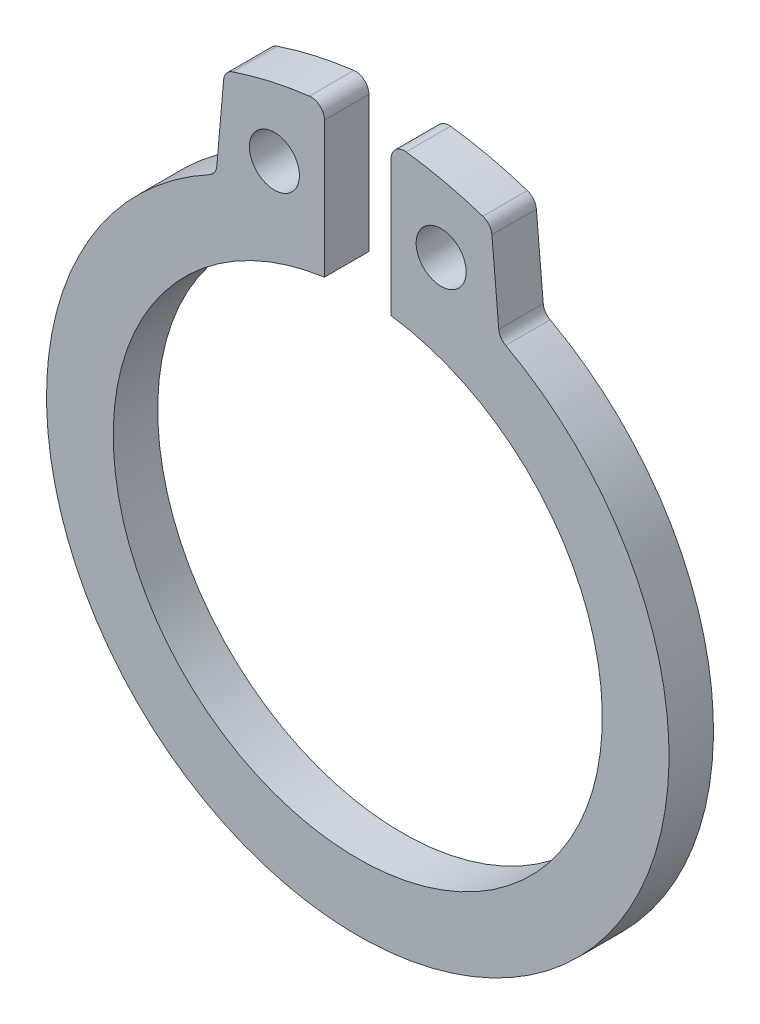
ISO-10303-21;
HEADER;
FILE_DESCRIPTION(('STEP AP214'),'2;1');
FILE_NAME('part.step','',(''),(''),'','','');
FILE_SCHEMA(('AUTOMOTIVE_DESIGN { 1 0 10303 214 1 1 1 1 }'));
ENDSEC;
DATA;
#1=APPLICATION_CONTEXT('core data for automotive mechanical design processes');
#2=APPLICATION_PROTOCOL_DEFINITION('international standard','automotive_design',2000,#1);
#3=PRODUCT_CONTEXT('',#1,'mechanical');
#4=PRODUCT('Part','Part','',(#3));
#5=PRODUCT_RELATED_PRODUCT_CATEGORY('part','',(#4));
#6=PRODUCT_DEFINITION_FORMATION('','',#4);
#7=PRODUCT_DEFINITION_CONTEXT('part definition',#1,'design');
#8=PRODUCT_DEFINITION('design','',#6,#7);
#9=PRODUCT_DEFINITION_SHAPE('','',#8);
#10=(LENGTH_UNIT() NAMED_UNIT(*) SI_UNIT(.MILLI.,.METRE.));
#11=(NAMED_UNIT(*) PLANE_ANGLE_UNIT() SI_UNIT($,.RADIAN.));
#12=(NAMED_UNIT(*) SI_UNIT($,.STERADIAN.) SOLID_ANGLE_UNIT());
#13=UNCERTAINTY_MEASURE_WITH_UNIT(LENGTH_MEASURE(1.E-05),#10,'distance_accuracy_value','');
#14=(GEOMETRIC_REPRESENTATION_CONTEXT(3) GLOBAL_UNCERTAINTY_ASSIGNED_CONTEXT((#13)) GLOBAL_UNIT_ASSIGNED_CONTEXT((#10,
#11,#12)) REPRESENTATION_CONTEXT('',''));
#15=CARTESIAN_POINT('',(0.,0.,0.));
#16=DIRECTION('',(0.,0.,1.));
#17=DIRECTION('',(1.,0.,0.));
#18=AXIS2_PLACEMENT_3D('',#15,#16,#17);
#19=CARTESIAN_POINT('',(0.,0.,1.));
#20=DIRECTION('',(0.,0.,-1.));
#21=DIRECTION('',(-1.,0.,0.));
#22=AXIS2_PLACEMENT_3D('',#19,#20,#21);
#23=PLANE('',#22);
#24=CARTESIAN_POINT('',(-1.875,7.14593837866892,1.));
#25=DIRECTION('',(0.,0.,1.));
#26=DIRECTION('',(1.,0.,0.));
#27=AXIS2_PLACEMENT_3D('',#24,#25,#26);
#28=CIRCLE('',#27,0.562500000000001);
#29=CARTESIAN_POINT('',(-1.3125,7.14593837866892,1.));
#30=VERTEX_POINT('',#29);
#31=EDGE_CURVE('E177',#30,#30,#28,.T.);
#32=ORIENTED_EDGE('',*,*,#31,.F.);
#33=EDGE_LOOP('',(#32));
#34=FACE_BOUND('',#33,.T.);
#35=CARTESIAN_POINT('',(0.,0.,1.));
#36=DIRECTION('',(0.,0.,1.));
#37=DIRECTION('',(-1.,0.,0.));
#38=AXIS2_PLACEMENT_3D('',#35,#36,#37);
#39=CIRCLE('',#38,8.875);
#40=CARTESIAN_POINT('',(2.81317449776246,8.41734365730299,1.));
#41=VERTEX_POINT('',#40);
#42=CARTESIAN_POINT('',(1.08673469387755,8.8082139338871,1.));
#43=VERTEX_POINT('',#42);
#44=EDGE_CURVE('E146',#41,#43,#39,.T.);
#45=ORIENTED_EDGE('',*,*,#44,.T.);
#46=CARTESIAN_POINT('',(1.05,8.51047149105148,1.));
#47=DIRECTION('',(0.,0.,-1.));
#48=DIRECTION('',(-1.,0.,0.));
#49=AXIS2_PLACEMENT_3D('',#46,#47,#48);
#50=CIRCLE('',#49,0.3);
#51=CARTESIAN_POINT('',(0.749999999999999,8.51047149105148,1.));
#52=VERTEX_POINT('',#51);
#53=EDGE_CURVE('E142',#43,#52,#50,.F.);
#54=ORIENTED_EDGE('',*,*,#53,.T.);
#55=DIRECTION('',(0.,-1.,0.));
#56=VECTOR('',#55,1.);
#57=CARTESIAN_POINT('',(0.749999999999999,8.843253077912,1.));
#58=LINE('',#57,#56);
#59=CARTESIAN_POINT('',(0.749999999999999,5.44862367942584,1.));
#60=VERTEX_POINT('',#59);
#61=EDGE_CURVE('E133',#52,#60,#58,.T.);
#62=ORIENTED_EDGE('',*,*,#61,.T.);
#63=CARTESIAN_POINT('',(0.,0.,1.));
#64=DIRECTION('',(0.,0.,-1.));
#65=DIRECTION('',(1.,0.,0.));
#66=AXIS2_PLACEMENT_3D('',#63,#64,#65);
#67=CIRCLE('',#66,5.5);
#68=CARTESIAN_POINT('',(-0.75,5.44862367942584,1.));
#69=VERTEX_POINT('',#68);
#70=EDGE_CURVE('E139',#60,#69,#67,.T.);
#71=ORIENTED_EDGE('',*,*,#70,.T.);
#72=DIRECTION('',(0.,1.,0.));
#73=VECTOR('',#72,1.);
#74=CARTESIAN_POINT('',(-0.75,8.843253077912,1.));
#75=LINE('',#74,#73);
#76=CARTESIAN_POINT('',(-0.75,8.51047149105148,1.));
#77=VERTEX_POINT('',#76);
#78=EDGE_CURVE('E161',#69,#77,#75,.T.);
#79=ORIENTED_EDGE('',*,*,#78,.T.);
#80=CARTESIAN_POINT('',(-1.05,8.51047149105148,1.));
#81=DIRECTION('',(0.,0.,-1.));
#82=DIRECTION('',(-1.,0.,0.));
#83=AXIS2_PLACEMENT_3D('',#80,#81,#82);
#84=CIRCLE('',#83,0.3);
#85=CARTESIAN_POINT('',(-1.08673469387755,8.8082139338871,1.));
#86=VERTEX_POINT('',#85);
#87=EDGE_CURVE('E223',#77,#86,#84,.F.);
#88=ORIENTED_EDGE('',*,*,#87,.T.);
#89=CARTESIAN_POINT('',(0.,0.,1.));
#90=DIRECTION('',(0.,0.,1.));
#91=DIRECTION('',(1.,0.,0.));
#92=AXIS2_PLACEMENT_3D('',#89,#90,#91);
#93=CIRCLE('',#92,8.875);
#94=CARTESIAN_POINT('',(-2.81317449776246,8.41734365730299,1.));
#95=VERTEX_POINT('',#94);
#96=EDGE_CURVE('E163',#86,#95,#93,.T.);
#97=ORIENTED_EDGE('',*,*,#96,.T.);
#98=CARTESIAN_POINT('',(-2.71808127530288,8.13281373085895,1.));
#99=DIRECTION('',(0.,0.,-1.));
#100=DIRECTION('',(-1.,0.,0.));
#101=AXIS2_PLACEMENT_3D('',#98,#99,#100);
#102=CIRCLE('',#101,0.3);
#103=CARTESIAN_POINT('',(-3.01693968473041,8.15896045368325,1.));
#104=VERTEX_POINT('',#103);
#105=EDGE_CURVE('E205',#95,#104,#102,.F.);
#106=ORIENTED_EDGE('',*,*,#105,.T.);
#107=DIRECTION('',(-0.0871557427476583,-0.996194698091746,0.));
#108=VECTOR('',#107,1.);
#109=CARTESIAN_POINT('',(-3.,8.35258193614406,1.));
#110=LINE('',#109,#108);
#111=CARTESIAN_POINT('',(-3.17114389581002,6.39639825573725,1.));
#112=VERTEX_POINT('',#111);
#113=EDGE_CURVE('E168',#104,#112,#110,.T.);
#114=ORIENTED_EDGE('',*,*,#113,.T.);
#115=CARTESIAN_POINT('',(-3.47000230523754,6.42254497856155,1.));
#116=DIRECTION('',(0.,0.,-1.));
#117=DIRECTION('',(-1.,0.,0.));
#118=AXIS2_PLACEMENT_3D('',#115,#116,#117);
#119=CIRCLE('',#118,0.3);
#120=CARTESIAN_POINT('',(-3.32739947077572,6.15860477396313,1.));
#121=VERTEX_POINT('',#120);
#122=EDGE_CURVE('E11',#112,#121,#119,.T.);
#123=ORIENTED_EDGE('',*,*,#122,.T.);
#124=CARTESIAN_POINT('',(0.,0.,1.));
#125=DIRECTION('',(0.,0.,1.));
#126=DIRECTION('',(1.,0.,0.));
#127=AXIS2_PLACEMENT_3D('',#124,#125,#126);
#128=CIRCLE('',#127,7.);
#129=CARTESIAN_POINT('',(3.32739947077572,6.15860477396313,1.));
#130=VERTEX_POINT('',#129);
#131=EDGE_CURVE('E170',#121,#130,#128,.T.);
#132=ORIENTED_EDGE('',*,*,#131,.T.);
#133=CARTESIAN_POINT('',(3.47000230523754,6.42254497856155,1.));
#134=DIRECTION('',(0.,0.,-1.));
#135=DIRECTION('',(-1.,0.,0.));
#136=AXIS2_PLACEMENT_3D('',#133,#134,#135);
#137=CIRCLE('',#136,0.3);
#138=CARTESIAN_POINT('',(3.17114389581001,6.39639825573725,1.));
#139=VERTEX_POINT('',#138);
#140=EDGE_CURVE('E242',#130,#139,#137,.T.);
#141=ORIENTED_EDGE('',*,*,#140,.T.);
#142=DIRECTION('',(-0.0871557427476584,0.996194698091746,0.));
#143=VECTOR('',#142,1.);
#144=CARTESIAN_POINT('',(3.,8.35258193614406,1.));
#145=LINE('',#144,#143);
#146=CARTESIAN_POINT('',(3.0169396847304,8.15896045368325,1.));
#147=VERTEX_POINT('',#146);
#148=EDGE_CURVE('E172',#139,#147,#145,.T.);
#149=ORIENTED_EDGE('',*,*,#148,.T.);
#150=CARTESIAN_POINT('',(2.71808127530288,8.13281373085895,1.));
#151=DIRECTION('',(0.,0.,-1.));
#152=DIRECTION('',(-1.,0.,0.));
#153=AXIS2_PLACEMENT_3D('',#150,#151,#152);
#154=CIRCLE('',#153,0.3);
#155=EDGE_CURVE('E207',#147,#41,#154,.F.);
#156=ORIENTED_EDGE('',*,*,#155,.T.);
#157=EDGE_LOOP('',(#45,#54,#62,#71,#79,#88,#97,#106,#114,#123,#132,#141,#149,#156));
#158=FACE_BOUND('',#157,.T.);
#159=CARTESIAN_POINT('',(1.875,7.14593837866892,1.));
#160=DIRECTION('',(0.,0.,1.));
#161=DIRECTION('',(-1.,0.,0.));
#162=AXIS2_PLACEMENT_3D('',#159,#160,#161);
#163=CIRCLE('',#162,0.562500000000001);
#164=CARTESIAN_POINT('',(1.3125,7.14593837866892,1.));
#165=VERTEX_POINT('',#164);
#166=EDGE_CURVE('E278',#165,#165,#163,.T.);
#167=ORIENTED_EDGE('',*,*,#166,.F.);
#168=EDGE_LOOP('',(#167));
#169=FACE_BOUND('',#168,.T.);
#170=ADVANCED_FACE('F34',(#34,#158,#169),#23,.F.);
#171=CARTESIAN_POINT('',(0.,0.,0.));
#172=DIRECTION('',(0.,0.,-1.));
#173=DIRECTION('',(-1.,0.,0.));
#174=AXIS2_PLACEMENT_3D('',#171,#172,#173);
#175=PLANE('',#174);
#176=CARTESIAN_POINT('',(-1.875,7.14593837866892,0.));
#177=DIRECTION('',(0.,0.,1.));
#178=DIRECTION('',(1.,0.,0.));
#179=AXIS2_PLACEMENT_3D('',#176,#177,#178);
#180=CIRCLE('',#179,0.562500000000001);
#181=CARTESIAN_POINT('',(-1.3125,7.14593837866892,0.));
#182=VERTEX_POINT('',#181);
#183=EDGE_CURVE('E275',#182,#182,#180,.T.);
#184=ORIENTED_EDGE('',*,*,#183,.T.);
#185=EDGE_LOOP('',(#184));
#186=FACE_BOUND('',#185,.T.);
#187=DIRECTION('',(0.,-1.,0.));
#188=VECTOR('',#187,1.);
#189=CARTESIAN_POINT('',(0.749999999999999,8.843253077912,0.));
#190=LINE('',#189,#188);
#191=CARTESIAN_POINT('',(0.749999999999999,8.51047149105148,0.));
#192=VERTEX_POINT('',#191);
#193=CARTESIAN_POINT('',(0.749999999999999,5.44862367942584,0.));
#194=VERTEX_POINT('',#193);
#195=EDGE_CURVE('E152',#192,#194,#190,.T.);
#196=ORIENTED_EDGE('',*,*,#195,.F.);
#197=CARTESIAN_POINT('',(1.05,8.51047149105148,0.));
#198=DIRECTION('',(0.,0.,-1.));
#199=DIRECTION('',(-1.,0.,0.));
#200=AXIS2_PLACEMENT_3D('',#197,#198,#199);
#201=CIRCLE('',#200,0.3);
#202=CARTESIAN_POINT('',(1.08673469387755,8.8082139338871,0.));
#203=VERTEX_POINT('',#202);
#204=EDGE_CURVE('E219',#192,#203,#201,.T.);
#205=ORIENTED_EDGE('',*,*,#204,.T.);
#206=CARTESIAN_POINT('',(0.,0.,0.));
#207=DIRECTION('',(0.,0.,1.));
#208=DIRECTION('',(-1.,0.,0.));
#209=AXIS2_PLACEMENT_3D('',#206,#207,#208);
#210=CIRCLE('',#209,8.875);
#211=CARTESIAN_POINT('',(2.81317449776246,8.41734365730299,0.));
#212=VERTEX_POINT('',#211);
#213=EDGE_CURVE('E174',#212,#203,#210,.T.);
#214=ORIENTED_EDGE('',*,*,#213,.F.);
#215=CARTESIAN_POINT('',(2.71808127530288,8.13281373085895,0.));
#216=DIRECTION('',(0.,0.,-1.));
#217=DIRECTION('',(-1.,0.,0.));
#218=AXIS2_PLACEMENT_3D('',#215,#216,#217);
#219=CIRCLE('',#218,0.3);
#220=CARTESIAN_POINT('',(3.0169396847304,8.15896045368325,0.));
#221=VERTEX_POINT('',#220);
#222=EDGE_CURVE('E199',#212,#221,#219,.T.);
#223=ORIENTED_EDGE('',*,*,#222,.T.);
#224=DIRECTION('',(-0.0871557427476584,0.996194698091746,0.));
#225=VECTOR('',#224,1.);
#226=CARTESIAN_POINT('',(3.,8.35258193614406,0.));
#227=LINE('',#226,#225);
#228=CARTESIAN_POINT('',(3.17114389581001,6.39639825573725,0.));
#229=VERTEX_POINT('',#228);
#230=EDGE_CURVE('E191',#229,#221,#227,.T.);
#231=ORIENTED_EDGE('',*,*,#230,.F.);
#232=CARTESIAN_POINT('',(3.47000230523754,6.42254497856155,0.));
#233=DIRECTION('',(0.,0.,-1.));
#234=DIRECTION('',(-1.,0.,0.));
#235=AXIS2_PLACEMENT_3D('',#232,#233,#234);
#236=CIRCLE('',#235,0.3);
#237=CARTESIAN_POINT('',(3.32739947077572,6.15860477396313,0.));
#238=VERTEX_POINT('',#237);
#239=EDGE_CURVE('E240',#229,#238,#236,.F.);
#240=ORIENTED_EDGE('',*,*,#239,.T.);
#241=CARTESIAN_POINT('',(0.,0.,0.));
#242=DIRECTION('',(0.,0.,1.));
#243=DIRECTION('',(1.,0.,0.));
#244=AXIS2_PLACEMENT_3D('',#241,#242,#243);
#245=CIRCLE('',#244,7.);
#246=CARTESIAN_POINT('',(-3.32739947077572,6.15860477396313,0.));
#247=VERTEX_POINT('',#246);
#248=EDGE_CURVE('E189',#247,#238,#245,.T.);
#249=ORIENTED_EDGE('',*,*,#248,.F.);
#250=CARTESIAN_POINT('',(-3.47000230523754,6.42254497856155,0.));
#251=DIRECTION('',(0.,0.,-1.));
#252=DIRECTION('',(-1.,0.,0.));
#253=AXIS2_PLACEMENT_3D('',#250,#251,#252);
#254=CIRCLE('',#253,0.3);
#255=CARTESIAN_POINT('',(-3.17114389581002,6.39639825573725,0.));
#256=VERTEX_POINT('',#255);
#257=EDGE_CURVE('E42',#247,#256,#254,.F.);
#258=ORIENTED_EDGE('',*,*,#257,.T.);
#259=DIRECTION('',(-0.0871557427476583,-0.996194698091746,0.));
#260=VECTOR('',#259,1.);
#261=CARTESIAN_POINT('',(-3.,8.35258193614406,0.));
#262=LINE('',#261,#260);
#263=CARTESIAN_POINT('',(-3.01693968473041,8.15896045368325,0.));
#264=VERTEX_POINT('',#263);
#265=EDGE_CURVE('E186',#264,#256,#262,.T.);
#266=ORIENTED_EDGE('',*,*,#265,.F.);
#267=CARTESIAN_POINT('',(-2.71808127530288,8.13281373085895,0.));
#268=DIRECTION('',(0.,0.,-1.));
#269=DIRECTION('',(-1.,0.,0.));
#270=AXIS2_PLACEMENT_3D('',#267,#268,#269);
#271=CIRCLE('',#270,0.3);
#272=CARTESIAN_POINT('',(-2.81317449776246,8.41734365730299,0.));
#273=VERTEX_POINT('',#272);
#274=EDGE_CURVE('E196',#264,#273,#271,.T.);
#275=ORIENTED_EDGE('',*,*,#274,.T.);
#276=CARTESIAN_POINT('',(0.,0.,0.));
#277=DIRECTION('',(0.,0.,1.));
#278=DIRECTION('',(1.,0.,0.));
#279=AXIS2_PLACEMENT_3D('',#276,#277,#278);
#280=CIRCLE('',#279,8.875);
#281=CARTESIAN_POINT('',(-1.08673469387755,8.8082139338871,0.));
#282=VERTEX_POINT('',#281);
#283=EDGE_CURVE('E184',#282,#273,#280,.T.);
#284=ORIENTED_EDGE('',*,*,#283,.F.);
#285=CARTESIAN_POINT('',(-1.05,8.51047149105148,0.));
#286=DIRECTION('',(0.,0.,-1.));
#287=DIRECTION('',(-1.,0.,0.));
#288=AXIS2_PLACEMENT_3D('',#285,#286,#287);
#289=CIRCLE('',#288,0.3);
#290=CARTESIAN_POINT('',(-0.75,8.51047149105148,0.));
#291=VERTEX_POINT('',#290);
#292=EDGE_CURVE('E217',#282,#291,#289,.T.);
#293=ORIENTED_EDGE('',*,*,#292,.T.);
#294=DIRECTION('',(0.,1.,0.));
#295=VECTOR('',#294,1.);
#296=CARTESIAN_POINT('',(-0.75,8.843253077912,0.));
#297=LINE('',#296,#295);
#298=CARTESIAN_POINT('',(-0.75,5.44862367942584,0.));
#299=VERTEX_POINT('',#298);
#300=EDGE_CURVE('E181',#299,#291,#297,.T.);
#301=ORIENTED_EDGE('',*,*,#300,.F.);
#302=CARTESIAN_POINT('',(0.,0.,0.));
#303=DIRECTION('',(0.,0.,-1.));
#304=DIRECTION('',(1.,0.,0.));
#305=AXIS2_PLACEMENT_3D('',#302,#303,#304);
#306=CIRCLE('',#305,5.5);
#307=EDGE_CURVE('E179',#194,#299,#306,.T.);
#308=ORIENTED_EDGE('',*,*,#307,.F.);
#309=EDGE_LOOP('',(#196,#205,#214,#223,#231,#240,#249,#258,#266,#275,#284,#293,#301,#308));
#310=FACE_BOUND('',#309,.T.);
#311=CARTESIAN_POINT('',(1.875,7.14593837866892,0.));
#312=DIRECTION('',(0.,0.,1.));
#313=DIRECTION('',(-1.,0.,0.));
#314=AXIS2_PLACEMENT_3D('',#311,#312,#313);
#315=CIRCLE('',#314,0.562500000000001);
#316=CARTESIAN_POINT('',(1.3125,7.14593837866892,0.));
#317=VERTEX_POINT('',#316);
#318=EDGE_CURVE('E281',#317,#317,#315,.T.);
#319=ORIENTED_EDGE('',*,*,#318,.T.);
#320=EDGE_LOOP('',(#319));
#321=FACE_BOUND('',#320,.T.);
#322=ADVANCED_FACE('F246',(#186,#310,#321),#175,.T.);
#323=CARTESIAN_POINT('',(0.,0.,1.));
#324=DIRECTION('',(0.,0.,-1.));
#325=DIRECTION('',(-1.,0.,0.));
#326=AXIS2_PLACEMENT_3D('',#323,#324,#325);
#327=CYLINDRICAL_SURFACE('',#326,8.875);
#328=ORIENTED_EDGE('',*,*,#213,.T.);
#329=DIRECTION('',(0.,0.,-1.));
#330=VECTOR('',#329,1.);
#331=CARTESIAN_POINT('',(1.08673469387755,8.8082139338871,1.));
#332=LINE('',#331,#330);
#333=EDGE_CURVE('E221',#203,#43,#332,.F.);
#334=ORIENTED_EDGE('',*,*,#333,.T.);
#335=ORIENTED_EDGE('',*,*,#44,.F.);
#336=DIRECTION('',(0.,0.,-1.));
#337=VECTOR('',#336,1.);
#338=CARTESIAN_POINT('',(2.81317449776246,8.41734365730299,1.));
#339=LINE('',#338,#337);
#340=EDGE_CURVE('E155',#41,#212,#339,.T.);
#341=ORIENTED_EDGE('',*,*,#340,.T.);
#342=EDGE_LOOP('',(#328,#334,#335,#341));
#343=FACE_BOUND('',#342,.T.);
#344=ADVANCED_FACE('F272',(#343),#327,.T.);
#345=CARTESIAN_POINT('',(0.749999999999999,8.843253077912,1.));
#346=DIRECTION('',(1.,0.,0.));
#347=DIRECTION('',(0.,0.,-1.));
#348=AXIS2_PLACEMENT_3D('',#345,#346,#347);
#349=PLANE('',#348);
#350=ORIENTED_EDGE('',*,*,#61,.F.);
#351=DIRECTION('',(0.,0.,-1.));
#352=VECTOR('',#351,1.);
#353=CARTESIAN_POINT('',(0.749999999999999,8.51047149105148,1.));
#354=LINE('',#353,#352);
#355=EDGE_CURVE('E215',#52,#192,#354,.T.);
#356=ORIENTED_EDGE('',*,*,#355,.T.);
#357=ORIENTED_EDGE('',*,*,#195,.T.);
#358=DIRECTION('',(0.,0.,-1.));
#359=VECTOR('',#358,1.);
#360=CARTESIAN_POINT('',(0.749999999999999,5.44862367942584,1.));
#361=LINE('',#360,#359);
#362=EDGE_CURVE('E149',#60,#194,#361,.T.);
#363=ORIENTED_EDGE('',*,*,#362,.F.);
#364=EDGE_LOOP('',(#350,#356,#357,#363));
#365=FACE_BOUND('',#364,.T.);
#366=ADVANCED_FACE('F150',(#365),#349,.F.);
#367=CARTESIAN_POINT('',(0.,0.,1.));
#368=DIRECTION('',(0.,0.,-1.));
#369=DIRECTION('',(-1.,0.,0.));
#370=AXIS2_PLACEMENT_3D('',#367,#368,#369);
#371=CYLINDRICAL_SURFACE('',#370,5.5);
#372=ORIENTED_EDGE('',*,*,#307,.T.);
#373=DIRECTION('',(0.,0.,-1.));
#374=VECTOR('',#373,1.);
#375=CARTESIAN_POINT('',(-0.75,5.44862367942584,1.));
#376=LINE('',#375,#374);
#377=EDGE_CURVE('E156',#69,#299,#376,.T.);
#378=ORIENTED_EDGE('',*,*,#377,.F.);
#379=ORIENTED_EDGE('',*,*,#70,.F.);
#380=ORIENTED_EDGE('',*,*,#362,.T.);
#381=EDGE_LOOP('',(#372,#378,#379,#380));
#382=FACE_BOUND('',#381,.T.);
#383=ADVANCED_FACE('F158',(#382),#371,.F.);
#384=CARTESIAN_POINT('',(-0.75,8.843253077912,1.));
#385=DIRECTION('',(-1.,0.,0.));
#386=DIRECTION('',(0.,0.,1.));
#387=AXIS2_PLACEMENT_3D('',#384,#385,#386);
#388=PLANE('',#387);
#389=ORIENTED_EDGE('',*,*,#300,.T.);
#390=DIRECTION('',(0.,0.,-1.));
#391=VECTOR('',#390,1.);
#392=CARTESIAN_POINT('',(-0.75,8.51047149105148,1.));
#393=LINE('',#392,#391);
#394=EDGE_CURVE('E229',#291,#77,#393,.F.);
#395=ORIENTED_EDGE('',*,*,#394,.T.);
#396=ORIENTED_EDGE('',*,*,#78,.F.);
#397=ORIENTED_EDGE('',*,*,#377,.T.);
#398=EDGE_LOOP('',(#389,#395,#396,#397));
#399=FACE_BOUND('',#398,.T.);
#400=ADVANCED_FACE('F311',(#399),#388,.F.);
#401=CARTESIAN_POINT('',(0.,0.,1.));
#402=DIRECTION('',(0.,0.,-1.));
#403=DIRECTION('',(-1.,0.,0.));
#404=AXIS2_PLACEMENT_3D('',#401,#402,#403);
#405=CYLINDRICAL_SURFACE('',#404,8.875);
#406=ORIENTED_EDGE('',*,*,#96,.F.);
#407=DIRECTION('',(0.,0.,-1.));
#408=VECTOR('',#407,1.);
#409=CARTESIAN_POINT('',(-1.08673469387755,8.8082139338871,1.));
#410=LINE('',#409,#408);
#411=EDGE_CURVE('E226',#86,#282,#410,.T.);
#412=ORIENTED_EDGE('',*,*,#411,.T.);
#413=ORIENTED_EDGE('',*,*,#283,.T.);
#414=DIRECTION('',(0.,0.,-1.));
#415=VECTOR('',#414,1.);
#416=CARTESIAN_POINT('',(-2.81317449776246,8.41734365730299,1.));
#417=LINE('',#416,#415);
#418=EDGE_CURVE('E212',#273,#95,#417,.F.);
#419=ORIENTED_EDGE('',*,*,#418,.T.);
#420=EDGE_LOOP('',(#406,#412,#413,#419));
#421=FACE_BOUND('',#420,.T.);
#422=ADVANCED_FACE('F308',(#421),#405,.T.);
#423=CARTESIAN_POINT('',(-3.,8.35258193614406,1.));
#424=DIRECTION('',(0.996194698091746,-0.0871557427476583,0.));
#425=DIRECTION('',(0.0871557427476583,0.996194698091746,0.));
#426=AXIS2_PLACEMENT_3D('',#423,#424,#425);
#427=PLANE('',#426);
#428=ORIENTED_EDGE('',*,*,#265,.T.);
#429=DIRECTION('',(0.,0.,1.));
#430=VECTOR('',#429,1.);
#431=CARTESIAN_POINT('',(-3.17114389581002,6.39639825573725,1.));
#432=LINE('',#431,#430);
#433=EDGE_CURVE('E238',#256,#112,#432,.T.);
#434=ORIENTED_EDGE('',*,*,#433,.T.);
#435=ORIENTED_EDGE('',*,*,#113,.F.);
#436=DIRECTION('',(0.,0.,-1.));
#437=VECTOR('',#436,1.);
#438=CARTESIAN_POINT('',(-3.01693968473041,8.15896045368325,1.));
#439=LINE('',#438,#437);
#440=EDGE_CURVE('E209',#104,#264,#439,.T.);
#441=ORIENTED_EDGE('',*,*,#440,.T.);
#442=EDGE_LOOP('',(#428,#434,#435,#441));
#443=FACE_BOUND('',#442,.T.);
#444=ADVANCED_FACE('F252',(#443),#427,.F.);
#445=CARTESIAN_POINT('',(0.,0.,1.));
#446=DIRECTION('',(0.,0.,-1.));
#447=DIRECTION('',(-1.,0.,0.));
#448=AXIS2_PLACEMENT_3D('',#445,#446,#447);
#449=CYLINDRICAL_SURFACE('',#448,7.);
#450=ORIENTED_EDGE('',*,*,#248,.T.);
#451=DIRECTION('',(0.,0.,-1.));
#452=VECTOR('',#451,1.);
#453=CARTESIAN_POINT('',(3.32739947077572,6.15860477396313,1.));
#454=LINE('',#453,#452);
#455=EDGE_CURVE('E49',#238,#130,#454,.F.);
#456=ORIENTED_EDGE('',*,*,#455,.T.);
#457=ORIENTED_EDGE('',*,*,#131,.F.);
#458=DIRECTION('',(0.,0.,-1.));
#459=VECTOR('',#458,1.);
#460=CARTESIAN_POINT('',(-3.32739947077572,6.15860477396313,1.));
#461=LINE('',#460,#459);
#462=EDGE_CURVE('E234',#121,#247,#461,.T.);
#463=ORIENTED_EDGE('',*,*,#462,.T.);
#464=EDGE_LOOP('',(#450,#456,#457,#463));
#465=FACE_BOUND('',#464,.T.);
#466=ADVANCED_FACE('F255',(#465),#449,.T.);
#467=CARTESIAN_POINT('',(3.,8.35258193614406,1.));
#468=DIRECTION('',(-0.996194698091746,-0.0871557427476584,0.));
#469=DIRECTION('',(0.0871557427476584,-0.996194698091746,0.));
#470=AXIS2_PLACEMENT_3D('',#467,#468,#469);
#471=PLANE('',#470);
#472=ORIENTED_EDGE('',*,*,#148,.F.);
#473=DIRECTION('',(0.,0.,1.));
#474=VECTOR('',#473,1.);
#475=CARTESIAN_POINT('',(3.17114389581001,6.39639825573725,0.));
#476=LINE('',#475,#474);
#477=EDGE_CURVE('E231',#139,#229,#476,.F.);
#478=ORIENTED_EDGE('',*,*,#477,.T.);
#479=ORIENTED_EDGE('',*,*,#230,.T.);
#480=DIRECTION('',(0.,0.,-1.));
#481=VECTOR('',#480,1.);
#482=CARTESIAN_POINT('',(3.0169396847304,8.15896045368325,1.));
#483=LINE('',#482,#481);
#484=EDGE_CURVE('E202',#221,#147,#483,.F.);
#485=ORIENTED_EDGE('',*,*,#484,.T.);
#486=EDGE_LOOP('',(#472,#478,#479,#485));
#487=FACE_BOUND('',#486,.T.);
#488=ADVANCED_FACE('F263',(#487),#471,.F.);
#489=CARTESIAN_POINT('',(-1.875,7.14593837866892,1.));
#490=DIRECTION('',(0.,0.,-1.));
#491=DIRECTION('',(-1.,0.,0.));
#492=AXIS2_PLACEMENT_3D('',#489,#490,#491);
#493=CYLINDRICAL_SURFACE('',#492,0.562500000000001);
#494=ORIENTED_EDGE('',*,*,#31,.T.);
#495=EDGE_LOOP('',(#494));
#496=FACE_BOUND('',#495,.T.);
#497=ORIENTED_EDGE('',*,*,#183,.F.);
#498=EDGE_LOOP('',(#497));
#499=FACE_BOUND('',#498,.T.);
#500=ADVANCED_FACE('F299',(#496,#499),#493,.F.);
#501=CARTESIAN_POINT('',(1.875,7.14593837866892,1.));
#502=DIRECTION('',(0.,0.,-1.));
#503=DIRECTION('',(-1.,0.,0.));
#504=AXIS2_PLACEMENT_3D('',#501,#502,#503);
#505=CYLINDRICAL_SURFACE('',#504,0.562500000000001);
#506=ORIENTED_EDGE('',*,*,#166,.T.);
#507=EDGE_LOOP('',(#506));
#508=FACE_BOUND('',#507,.T.);
#509=ORIENTED_EDGE('',*,*,#318,.F.);
#510=EDGE_LOOP('',(#509));
#511=FACE_BOUND('',#510,.T.);
#512=ADVANCED_FACE('F287',(#508,#511),#505,.F.);
#513=CARTESIAN_POINT('',(2.71808127530288,8.13281373085895,1.));
#514=DIRECTION('',(0.,0.,-1.));
#515=DIRECTION('',(-1.,0.,0.));
#516=AXIS2_PLACEMENT_3D('',#513,#514,#515);
#517=CYLINDRICAL_SURFACE('',#516,0.3);
#518=ORIENTED_EDGE('',*,*,#155,.F.);
#519=ORIENTED_EDGE('',*,*,#484,.F.);
#520=ORIENTED_EDGE('',*,*,#222,.F.);
#521=ORIENTED_EDGE('',*,*,#340,.F.);
#522=EDGE_LOOP('',(#518,#519,#520,#521));
#523=FACE_BOUND('',#522,.T.);
#524=ADVANCED_FACE('F269',(#523),#517,.T.);
#525=CARTESIAN_POINT('',(-2.71808127530288,8.13281373085895,1.));
#526=DIRECTION('',(0.,0.,-1.));
#527=DIRECTION('',(-1.,0.,0.));
#528=AXIS2_PLACEMENT_3D('',#525,#526,#527);
#529=CYLINDRICAL_SURFACE('',#528,0.3);
#530=ORIENTED_EDGE('',*,*,#105,.F.);
#531=ORIENTED_EDGE('',*,*,#418,.F.);
#532=ORIENTED_EDGE('',*,*,#274,.F.);
#533=ORIENTED_EDGE('',*,*,#440,.F.);
#534=EDGE_LOOP('',(#530,#531,#532,#533));
#535=FACE_BOUND('',#534,.T.);
#536=ADVANCED_FACE('F324',(#535),#529,.T.);
#537=CARTESIAN_POINT('',(1.05,8.51047149105148,1.));
#538=DIRECTION('',(0.,0.,-1.));
#539=DIRECTION('',(-1.,0.,0.));
#540=AXIS2_PLACEMENT_3D('',#537,#538,#539);
#541=CYLINDRICAL_SURFACE('',#540,0.3);
#542=ORIENTED_EDGE('',*,*,#53,.F.);
#543=ORIENTED_EDGE('',*,*,#333,.F.);
#544=ORIENTED_EDGE('',*,*,#204,.F.);
#545=ORIENTED_EDGE('',*,*,#355,.F.);
#546=EDGE_LOOP('',(#542,#543,#544,#545));
#547=FACE_BOUND('',#546,.T.);
#548=ADVANCED_FACE('F327',(#547),#541,.T.);
#549=CARTESIAN_POINT('',(-1.05,8.51047149105148,1.));
#550=DIRECTION('',(0.,0.,-1.));
#551=DIRECTION('',(-1.,0.,0.));
#552=AXIS2_PLACEMENT_3D('',#549,#550,#551);
#553=CYLINDRICAL_SURFACE('',#552,0.3);
#554=ORIENTED_EDGE('',*,*,#87,.F.);
#555=ORIENTED_EDGE('',*,*,#394,.F.);
#556=ORIENTED_EDGE('',*,*,#292,.F.);
#557=ORIENTED_EDGE('',*,*,#411,.F.);
#558=EDGE_LOOP('',(#554,#555,#556,#557));
#559=FACE_BOUND('',#558,.T.);
#560=ADVANCED_FACE('F331',(#559),#553,.T.);
#561=CARTESIAN_POINT('',(3.47000230523754,6.42254497856155,1.));
#562=DIRECTION('',(0.,0.,-1.));
#563=DIRECTION('',(-1.,0.,0.));
#564=AXIS2_PLACEMENT_3D('',#561,#562,#563);
#565=CYLINDRICAL_SURFACE('',#564,0.3);
#566=ORIENTED_EDGE('',*,*,#140,.F.);
#567=ORIENTED_EDGE('',*,*,#455,.F.);
#568=ORIENTED_EDGE('',*,*,#239,.F.);
#569=ORIENTED_EDGE('',*,*,#477,.F.);
#570=EDGE_LOOP('',(#566,#567,#568,#569));
#571=FACE_BOUND('',#570,.T.);
#572=ADVANCED_FACE('F260',(#571),#565,.F.);
#573=CARTESIAN_POINT('',(-3.47000230523754,6.42254497856155,1.));
#574=DIRECTION('',(0.,0.,-1.));
#575=DIRECTION('',(-1.,0.,0.));
#576=AXIS2_PLACEMENT_3D('',#573,#574,#575);
#577=CYLINDRICAL_SURFACE('',#576,0.3);
#578=ORIENTED_EDGE('',*,*,#122,.F.);
#579=ORIENTED_EDGE('',*,*,#433,.F.);
#580=ORIENTED_EDGE('',*,*,#257,.F.);
#581=ORIENTED_EDGE('',*,*,#462,.F.);
#582=EDGE_LOOP('',(#578,#579,#580,#581));
#583=FACE_BOUND('',#582,.T.);
#584=ADVANCED_FACE('F36',(#583),#577,.F.);
#585=CLOSED_SHELL('',(#170,#322,#344,#366,#383,#400,#422,#444,#466,#488,#500,#512,#524,#536,
#548,#560,#572,#584));
#586=MANIFOLD_SOLID_BREP('B2',#585);
#587=ADVANCED_BREP_SHAPE_REPRESENTATION('',(#18,#586),#14);
#588=SHAPE_DEFINITION_REPRESENTATION(#9,#587);
ENDSEC;
END-ISO-10303-21;
